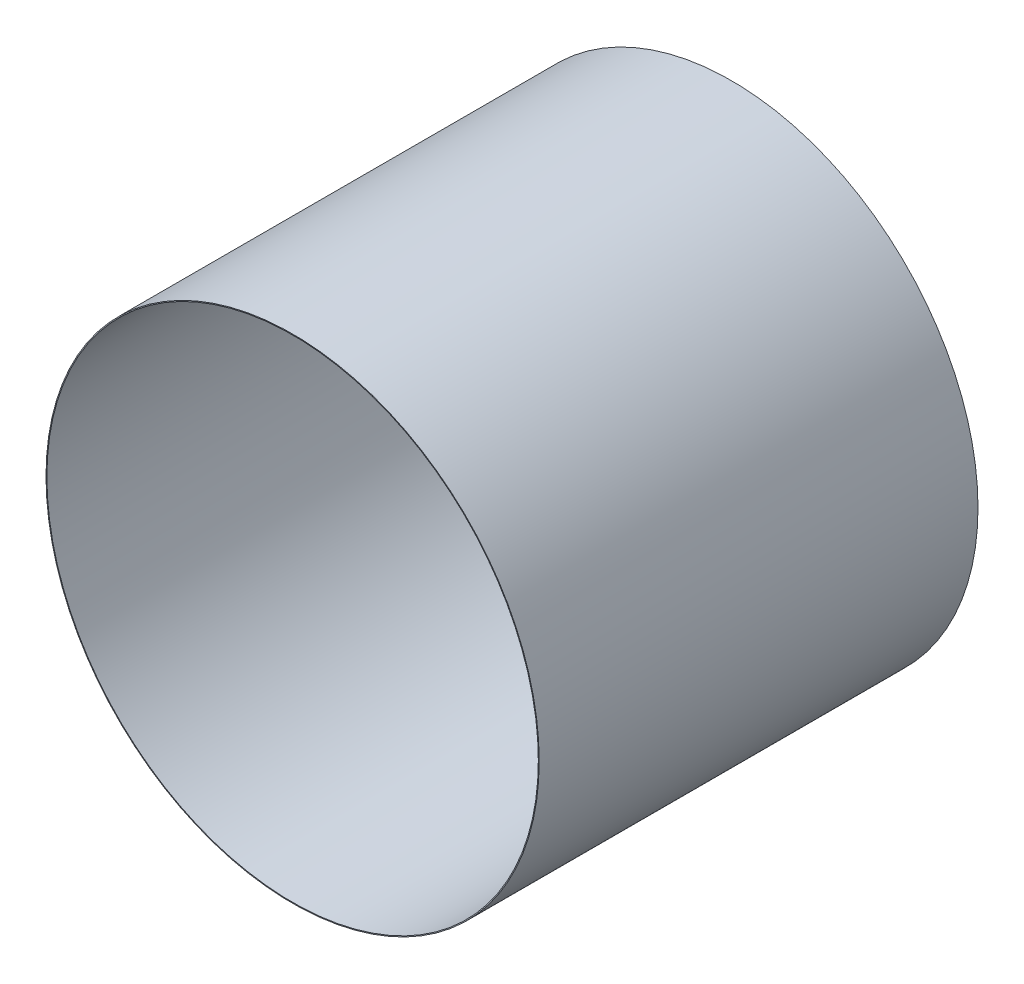
ISO-10303-21;
HEADER;
FILE_DESCRIPTION(('STEP AP214'),'2;1');
FILE_NAME('part.step','',(''),(''),'','','');
FILE_SCHEMA(('AUTOMOTIVE_DESIGN { 1 0 10303 214 1 1 1 1 }'));
ENDSEC;
DATA;
#1=APPLICATION_CONTEXT('core data for automotive mechanical design processes');
#2=APPLICATION_PROTOCOL_DEFINITION('international standard','automotive_design',2000,#1);
#3=PRODUCT_CONTEXT('',#1,'mechanical');
#4=PRODUCT('Part','Part','',(#3));
#5=PRODUCT_RELATED_PRODUCT_CATEGORY('part','',(#4));
#6=PRODUCT_DEFINITION_FORMATION('','',#4);
#7=PRODUCT_DEFINITION_CONTEXT('part definition',#1,'design');
#8=PRODUCT_DEFINITION('design','',#6,#7);
#9=PRODUCT_DEFINITION_SHAPE('','',#8);
#10=(LENGTH_UNIT() NAMED_UNIT(*) SI_UNIT(.MILLI.,.METRE.));
#11=(NAMED_UNIT(*) PLANE_ANGLE_UNIT() SI_UNIT($,.RADIAN.));
#12=(NAMED_UNIT(*) SI_UNIT($,.STERADIAN.) SOLID_ANGLE_UNIT());
#13=UNCERTAINTY_MEASURE_WITH_UNIT(LENGTH_MEASURE(1.E-05),#10,'distance_accuracy_value','');
#14=(GEOMETRIC_REPRESENTATION_CONTEXT(3) GLOBAL_UNCERTAINTY_ASSIGNED_CONTEXT((#13)) GLOBAL_UNIT_ASSIGNED_CONTEXT((#10,
#11,#12)) REPRESENTATION_CONTEXT('',''));
#15=CARTESIAN_POINT('',(0.,0.,0.));
#16=DIRECTION('',(0.,0.,1.));
#17=DIRECTION('',(1.,0.,0.));
#18=AXIS2_PLACEMENT_3D('',#15,#16,#17);
#19=CARTESIAN_POINT('',(0.,0.,25.));
#20=DIRECTION('',(0.,0.,1.));
#21=DIRECTION('',(1.,0.,0.));
#22=AXIS2_PLACEMENT_3D('',#19,#20,#21);
#23=PLANE('',#22);
#24=CARTESIAN_POINT('',(0.,0.,25.));
#25=DIRECTION('',(0.,0.,1.));
#26=DIRECTION('',(1.,0.,0.));
#27=AXIS2_PLACEMENT_3D('',#24,#25,#26);
#28=CIRCLE('',#27,14.05);
#29=CARTESIAN_POINT('',(14.05,0.,25.));
#30=VERTEX_POINT('',#29);
#31=EDGE_CURVE('E10',#30,#30,#28,.T.);
#32=ORIENTED_EDGE('',*,*,#31,.T.);
#33=EDGE_LOOP('',(#32));
#34=FACE_BOUND('',#33,.T.);
#35=CARTESIAN_POINT('',(0.,0.,25.));
#36=DIRECTION('',(0.,0.,1.));
#37=DIRECTION('',(1.,0.,0.));
#38=AXIS2_PLACEMENT_3D('',#35,#36,#37);
#39=CIRCLE('',#38,14.);
#40=CARTESIAN_POINT('',(14.,0.,25.));
#41=VERTEX_POINT('',#40);
#42=EDGE_CURVE('E42',#41,#41,#39,.T.);
#43=ORIENTED_EDGE('',*,*,#42,.F.);
#44=EDGE_LOOP('',(#43));
#45=FACE_BOUND('',#44,.T.);
#46=ADVANCED_FACE('F31',(#34,#45),#23,.T.);
#47=CARTESIAN_POINT('',(0.,0.,0.));
#48=DIRECTION('',(0.,0.,1.));
#49=DIRECTION('',(1.,0.,0.));
#50=AXIS2_PLACEMENT_3D('',#47,#48,#49);
#51=PLANE('',#50);
#52=CARTESIAN_POINT('',(0.,0.,0.));
#53=DIRECTION('',(0.,0.,1.));
#54=DIRECTION('',(1.,0.,0.));
#55=AXIS2_PLACEMENT_3D('',#52,#53,#54);
#56=CIRCLE('',#55,14.05);
#57=CARTESIAN_POINT('',(14.05,0.,0.));
#58=VERTEX_POINT('',#57);
#59=EDGE_CURVE('E35',#58,#58,#56,.T.);
#60=ORIENTED_EDGE('',*,*,#59,.F.);
#61=EDGE_LOOP('',(#60));
#62=FACE_BOUND('',#61,.T.);
#63=CARTESIAN_POINT('',(0.,0.,0.));
#64=DIRECTION('',(0.,0.,1.));
#65=DIRECTION('',(1.,0.,0.));
#66=AXIS2_PLACEMENT_3D('',#63,#64,#65);
#67=CIRCLE('',#66,14.);
#68=CARTESIAN_POINT('',(14.,0.,0.));
#69=VERTEX_POINT('',#68);
#70=EDGE_CURVE('E44',#69,#69,#67,.T.);
#71=ORIENTED_EDGE('',*,*,#70,.T.);
#72=EDGE_LOOP('',(#71));
#73=FACE_BOUND('',#72,.T.);
#74=ADVANCED_FACE('F54',(#62,#73),#51,.F.);
#75=CARTESIAN_POINT('',(0.,0.,25.));
#76=DIRECTION('',(0.,0.,-1.));
#77=DIRECTION('',(-1.,0.,0.));
#78=AXIS2_PLACEMENT_3D('',#75,#76,#77);
#79=CYLINDRICAL_SURFACE('',#78,14.05);
#80=ORIENTED_EDGE('',*,*,#31,.F.);
#81=EDGE_LOOP('',(#80));
#82=FACE_BOUND('',#81,.T.);
#83=ORIENTED_EDGE('',*,*,#59,.T.);
#84=EDGE_LOOP('',(#83));
#85=FACE_BOUND('',#84,.T.);
#86=ADVANCED_FACE('F33',(#82,#85),#79,.T.);
#87=CARTESIAN_POINT('',(0.,0.,25.));
#88=DIRECTION('',(0.,0.,-1.));
#89=DIRECTION('',(-1.,0.,0.));
#90=AXIS2_PLACEMENT_3D('',#87,#88,#89);
#91=CYLINDRICAL_SURFACE('',#90,14.);
#92=ORIENTED_EDGE('',*,*,#42,.T.);
#93=EDGE_LOOP('',(#92));
#94=FACE_BOUND('',#93,.T.);
#95=ORIENTED_EDGE('',*,*,#70,.F.);
#96=EDGE_LOOP('',(#95));
#97=FACE_BOUND('',#96,.T.);
#98=ADVANCED_FACE('F50',(#94,#97),#91,.F.);
#99=CLOSED_SHELL('',(#46,#74,#86,#98));
#100=MANIFOLD_SOLID_BREP('B2',#99);
#101=ADVANCED_BREP_SHAPE_REPRESENTATION('',(#18,#100),#14);
#102=SHAPE_DEFINITION_REPRESENTATION(#9,#101);
ENDSEC;
END-ISO-10303-21;
